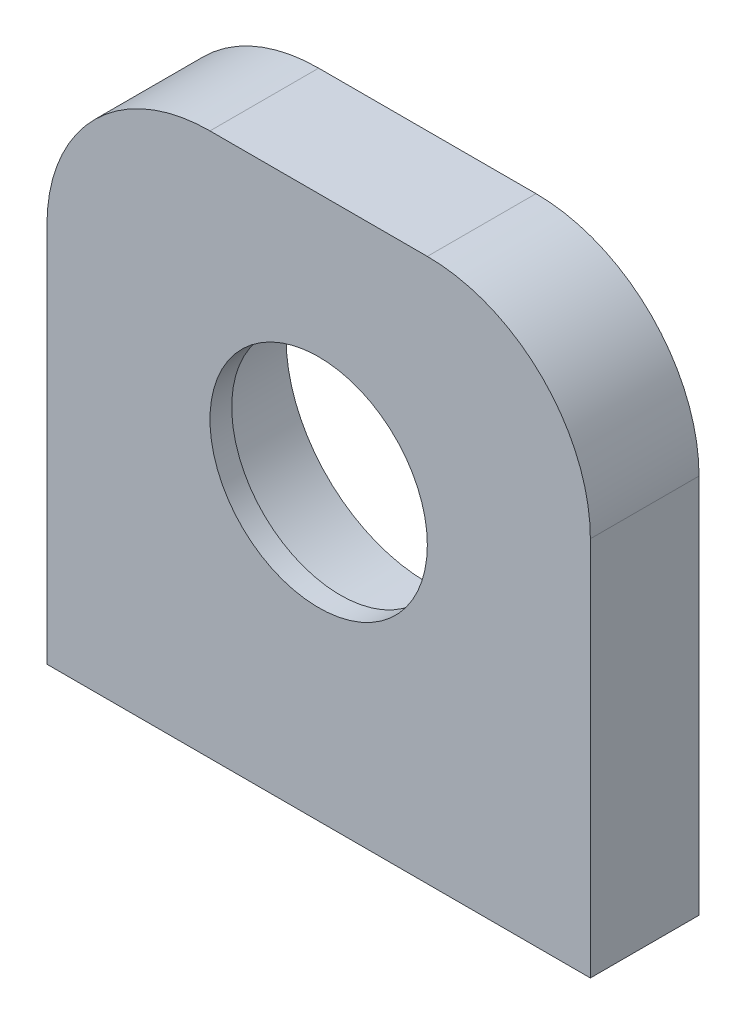
ISO-10303-21;
HEADER;
FILE_DESCRIPTION(('STEP AP214'),'2;1');
FILE_NAME('part.step','',(''),(''),'','','');
FILE_SCHEMA(('AUTOMOTIVE_DESIGN { 1 0 10303 214 1 1 1 1 }'));
ENDSEC;
DATA;
#1=APPLICATION_CONTEXT('core data for automotive mechanical design processes');
#2=APPLICATION_PROTOCOL_DEFINITION('international standard','automotive_design',2000,#1);
#3=PRODUCT_CONTEXT('',#1,'mechanical');
#4=PRODUCT('Part','Part','',(#3));
#5=PRODUCT_RELATED_PRODUCT_CATEGORY('part','',(#4));
#6=PRODUCT_DEFINITION_FORMATION('','',#4);
#7=PRODUCT_DEFINITION_CONTEXT('part definition',#1,'design');
#8=PRODUCT_DEFINITION('design','',#6,#7);
#9=PRODUCT_DEFINITION_SHAPE('','',#8);
#10=(LENGTH_UNIT() NAMED_UNIT(*) SI_UNIT(.MILLI.,.METRE.));
#11=(NAMED_UNIT(*) PLANE_ANGLE_UNIT() SI_UNIT($,.RADIAN.));
#12=(NAMED_UNIT(*) SI_UNIT($,.STERADIAN.) SOLID_ANGLE_UNIT());
#13=UNCERTAINTY_MEASURE_WITH_UNIT(LENGTH_MEASURE(1.E-05),#10,'distance_accuracy_value','');
#14=(GEOMETRIC_REPRESENTATION_CONTEXT(3) GLOBAL_UNCERTAINTY_ASSIGNED_CONTEXT((#13)) GLOBAL_UNIT_ASSIGNED_CONTEXT((#10,
#11,#12)) REPRESENTATION_CONTEXT('',''));
#15=CARTESIAN_POINT('',(0.,0.,0.));
#16=DIRECTION('',(0.,0.,1.));
#17=DIRECTION('',(1.,0.,0.));
#18=AXIS2_PLACEMENT_3D('',#15,#16,#17);
#19=CARTESIAN_POINT('',(160.058415841584,225.233724981792,6.00000000008549));
#20=DIRECTION('',(0.,0.,-1.));
#21=DIRECTION('',(0.,1.,0.));
#22=AXIS2_PLACEMENT_3D('',#19,#20,#21);
#23=CONICAL_SURFACE('',#22,1.24999999989384,1.02974425853419);
#24=CARTESIAN_POINT('',(160.058415841632,225.233724981792,6.75107577384892));
#25=VERTEX_POINT('',#24);
#26=VERTEX_LOOP('',#25);
#27=FACE_BOUND('',#26,.T.);
#28=CARTESIAN_POINT('',(160.058415841584,225.233724981792,6.));
#29=DIRECTION('',(0.,0.,-1.));
#30=DIRECTION('',(-1.,0.,0.));
#31=AXIS2_PLACEMENT_3D('',#28,#29,#30);
#32=CIRCLE('',#31,1.25);
#33=CARTESIAN_POINT('',(158.808415841584,225.233724981792,6.));
#34=VERTEX_POINT('',#33);
#35=EDGE_CURVE('E94',#34,#34,#32,.T.);
#36=ORIENTED_EDGE('',*,*,#35,.T.);
#37=EDGE_LOOP('',(#36));
#38=FACE_BOUND('',#37,.T.);
#39=ADVANCED_FACE('F17',(#27,#38),#23,.F.);
#40=CARTESIAN_POINT('',(144.558415841584,240.733724981792,6.00000000002865));
#41=DIRECTION('',(0.,0.,-1.));
#42=DIRECTION('',(-1.,0.,0.));
#43=AXIS2_PLACEMENT_3D('',#40,#41,#42);
#44=CONICAL_SURFACE('',#43,1.24999999998204,1.02974425857642);
#45=CARTESIAN_POINT('',(144.558415841573,240.733724981792,6.7510757738205));
#46=VERTEX_POINT('',#45);
#47=VERTEX_LOOP('',#46);
#48=FACE_BOUND('',#47,.T.);
#49=CARTESIAN_POINT('',(144.558415841584,240.733724981792,6.));
#50=DIRECTION('',(0.,0.,-1.));
#51=DIRECTION('',(-1.,0.,0.));
#52=AXIS2_PLACEMENT_3D('',#49,#50,#51);
#53=CIRCLE('',#52,1.25);
#54=CARTESIAN_POINT('',(143.308415841584,240.733724981792,6.));
#55=VERTEX_POINT('',#54);
#56=EDGE_CURVE('E96',#55,#55,#53,.T.);
#57=ORIENTED_EDGE('',*,*,#56,.T.);
#58=EDGE_LOOP('',(#57));
#59=FACE_BOUND('',#58,.T.);
#60=ADVANCED_FACE('F91',(#48,#59),#44,.F.);
#61=CARTESIAN_POINT('',(129.058415841584,225.233724981792,5.99999999997181));
#62=DIRECTION('',(0.,0.,-1.));
#63=DIRECTION('',(-1.,0.,0.));
#64=AXIS2_PLACEMENT_3D('',#61,#62,#63);
#65=CONICAL_SURFACE('',#64,1.25000000007025,1.02974425858524);
#66=CARTESIAN_POINT('',(129.058415841627,225.233724981792,6.75107577384892));
#67=VERTEX_POINT('',#66);
#68=VERTEX_LOOP('',#67);
#69=FACE_BOUND('',#68,.T.);
#70=CARTESIAN_POINT('',(129.058415841584,225.233724981792,6.));
#71=DIRECTION('',(0.,0.,-1.));
#72=DIRECTION('',(-1.,0.,0.));
#73=AXIS2_PLACEMENT_3D('',#70,#71,#72);
#74=CIRCLE('',#73,1.25);
#75=CARTESIAN_POINT('',(127.808415841584,225.233724981792,6.));
#76=VERTEX_POINT('',#75);
#77=EDGE_CURVE('E99',#76,#76,#74,.T.);
#78=ORIENTED_EDGE('',*,*,#77,.T.);
#79=EDGE_LOOP('',(#78));
#80=FACE_BOUND('',#79,.T.);
#81=ADVANCED_FACE('F163',(#69,#80),#65,.F.);
#82=CARTESIAN_POINT('',(144.558415841584,209.733724981792,6.00000000002865));
#83=DIRECTION('',(0.,0.,-1.));
#84=DIRECTION('',(-1.,0.,0.));
#85=AXIS2_PLACEMENT_3D('',#82,#83,#84);
#86=CONICAL_SURFACE('',#85,1.24999999998204,1.02974425857642);
#87=CARTESIAN_POINT('',(144.558415841573,209.733724981792,6.7510757738205));
#88=VERTEX_POINT('',#87);
#89=VERTEX_LOOP('',#88);
#90=FACE_BOUND('',#89,.T.);
#91=CARTESIAN_POINT('',(144.558415841584,209.733724981792,6.));
#92=DIRECTION('',(0.,0.,-1.));
#93=DIRECTION('',(-1.,0.,0.));
#94=AXIS2_PLACEMENT_3D('',#91,#92,#93);
#95=CIRCLE('',#94,1.25);
#96=CARTESIAN_POINT('',(143.308415841584,209.733724981792,6.));
#97=VERTEX_POINT('',#96);
#98=EDGE_CURVE('E153',#97,#97,#95,.T.);
#99=ORIENTED_EDGE('',*,*,#98,.T.);
#100=EDGE_LOOP('',(#99));
#101=FACE_BOUND('',#100,.T.);
#102=ADVANCED_FACE('F255',(#90,#101),#86,.F.);
#103=CARTESIAN_POINT('',(129.558415841584,210.630851485064,5.));
#104=DIRECTION('',(0.,-1.,0.));
#105=DIRECTION('',(1.,0.,0.));
#106=AXIS2_PLACEMENT_3D('',#103,#104,#105);
#107=CONICAL_SURFACE('',#106,2.10000000004583,1.0297442586746);
#108=CARTESIAN_POINT('',(129.558415841584,211.892658785018,5.0000000001944));
#109=VERTEX_POINT('',#108);
#110=VERTEX_LOOP('',#109);
#111=FACE_BOUND('',#110,.T.);
#112=CARTESIAN_POINT('',(129.558415841584,210.630851485148,5.));
#113=DIRECTION('',(0.,-1.,0.));
#114=DIRECTION('',(0.,0.,-1.));
#115=AXIS2_PLACEMENT_3D('',#112,#113,#114);
#116=CIRCLE('',#115,2.09999999999999);
#117=CARTESIAN_POINT('',(129.558415841584,210.630851485148,2.9));
#118=VERTEX_POINT('',#117);
#119=EDGE_CURVE('E148',#118,#118,#116,.T.);
#120=ORIENTED_EDGE('',*,*,#119,.T.);
#121=EDGE_LOOP('',(#120));
#122=FACE_BOUND('',#121,.T.);
#123=ADVANCED_FACE('F257',(#111,#122),#107,.F.);
#124=CARTESIAN_POINT('',(159.558415841584,210.630851485064,5.));
#125=DIRECTION('',(0.,-1.,0.));
#126=DIRECTION('',(1.,0.,0.));
#127=AXIS2_PLACEMENT_3D('',#124,#125,#126);
#128=CONICAL_SURFACE('',#127,2.10000000004584,1.0297442586746);
#129=CARTESIAN_POINT('',(159.558415841584,211.892658785018,5.0000000001944));
#130=VERTEX_POINT('',#129);
#131=VERTEX_LOOP('',#130);
#132=FACE_BOUND('',#131,.T.);
#133=CARTESIAN_POINT('',(159.558415841584,210.630851485148,5.));
#134=DIRECTION('',(0.,-1.,0.));
#135=DIRECTION('',(0.,0.,-1.));
#136=AXIS2_PLACEMENT_3D('',#133,#134,#135);
#137=CIRCLE('',#136,2.09999999999999);
#138=CARTESIAN_POINT('',(159.558415841584,210.630851485148,2.90000000000001));
#139=VERTEX_POINT('',#138);
#140=EDGE_CURVE('E144',#139,#139,#137,.T.);
#141=ORIENTED_EDGE('',*,*,#140,.T.);
#142=EDGE_LOOP('',(#141));
#143=FACE_BOUND('',#142,.T.);
#144=ADVANCED_FACE('F264',(#132,#143),#128,.F.);
#145=CARTESIAN_POINT('',(160.058415841584,225.233724981792,0.));
#146=DIRECTION('',(0.,0.,-1.));
#147=DIRECTION('',(-1.,0.,0.));
#148=AXIS2_PLACEMENT_3D('',#145,#146,#147);
#149=CYLINDRICAL_SURFACE('',#148,1.25);
#150=CARTESIAN_POINT('',(160.058415841584,225.233724981792,0.));
#151=DIRECTION('',(0.,0.,-1.));
#152=DIRECTION('',(-1.,0.,0.));
#153=AXIS2_PLACEMENT_3D('',#150,#151,#152);
#154=CIRCLE('',#153,1.25);
#155=CARTESIAN_POINT('',(158.808415841584,225.233724981792,0.));
#156=VERTEX_POINT('',#155);
#157=EDGE_CURVE('E20',#156,#156,#154,.F.);
#158=ORIENTED_EDGE('',*,*,#157,.F.);
#159=EDGE_LOOP('',(#158));
#160=FACE_BOUND('',#159,.T.);
#161=ORIENTED_EDGE('',*,*,#35,.F.);
#162=EDGE_LOOP('',(#161));
#163=FACE_BOUND('',#162,.T.);
#164=ADVANCED_FACE('F179',(#160,#163),#149,.F.);
#165=CARTESIAN_POINT('',(144.558415841584,240.733724981792,0.));
#166=DIRECTION('',(0.,0.,-1.));
#167=DIRECTION('',(-1.,0.,0.));
#168=AXIS2_PLACEMENT_3D('',#165,#166,#167);
#169=CYLINDRICAL_SURFACE('',#168,1.25);
#170=CARTESIAN_POINT('',(144.558415841584,240.733724981792,0.));
#171=DIRECTION('',(0.,0.,-1.));
#172=DIRECTION('',(-1.,0.,0.));
#173=AXIS2_PLACEMENT_3D('',#170,#171,#172);
#174=CIRCLE('',#173,1.25);
#175=CARTESIAN_POINT('',(143.308415841584,240.733724981792,0.));
#176=VERTEX_POINT('',#175);
#177=EDGE_CURVE('E139',#176,#176,#174,.F.);
#178=ORIENTED_EDGE('',*,*,#177,.F.);
#179=EDGE_LOOP('',(#178));
#180=FACE_BOUND('',#179,.T.);
#181=ORIENTED_EDGE('',*,*,#56,.F.);
#182=EDGE_LOOP('',(#181));
#183=FACE_BOUND('',#182,.T.);
#184=ADVANCED_FACE('F168',(#180,#183),#169,.F.);
#185=CARTESIAN_POINT('',(129.058415841584,225.233724981792,0.));
#186=DIRECTION('',(0.,0.,-1.));
#187=DIRECTION('',(-1.,0.,0.));
#188=AXIS2_PLACEMENT_3D('',#185,#186,#187);
#189=CYLINDRICAL_SURFACE('',#188,1.25);
#190=CARTESIAN_POINT('',(129.058415841584,225.233724981792,0.));
#191=DIRECTION('',(0.,0.,-1.));
#192=DIRECTION('',(-1.,0.,0.));
#193=AXIS2_PLACEMENT_3D('',#190,#191,#192);
#194=CIRCLE('',#193,1.25);
#195=CARTESIAN_POINT('',(127.808415841584,225.233724981792,0.));
#196=VERTEX_POINT('',#195);
#197=EDGE_CURVE('E137',#196,#196,#194,.F.);
#198=ORIENTED_EDGE('',*,*,#197,.F.);
#199=EDGE_LOOP('',(#198));
#200=FACE_BOUND('',#199,.T.);
#201=ORIENTED_EDGE('',*,*,#77,.F.);
#202=EDGE_LOOP('',(#201));
#203=FACE_BOUND('',#202,.T.);
#204=ADVANCED_FACE('F165',(#200,#203),#189,.F.);
#205=CARTESIAN_POINT('',(144.558415841584,209.733724981792,0.));
#206=DIRECTION('',(0.,0.,-1.));
#207=DIRECTION('',(-1.,0.,0.));
#208=AXIS2_PLACEMENT_3D('',#205,#206,#207);
#209=CYLINDRICAL_SURFACE('',#208,1.25);
#210=CARTESIAN_POINT('',(144.558415841584,209.733724981792,0.));
#211=DIRECTION('',(0.,0.,-1.));
#212=DIRECTION('',(-1.,0.,0.));
#213=AXIS2_PLACEMENT_3D('',#210,#211,#212);
#214=CIRCLE('',#213,1.25);
#215=CARTESIAN_POINT('',(143.308415841584,209.733724981792,0.));
#216=VERTEX_POINT('',#215);
#217=EDGE_CURVE('E134',#216,#216,#214,.F.);
#218=ORIENTED_EDGE('',*,*,#217,.F.);
#219=EDGE_LOOP('',(#218));
#220=FACE_BOUND('',#219,.T.);
#221=ORIENTED_EDGE('',*,*,#98,.F.);
#222=EDGE_LOOP('',(#221));
#223=FACE_BOUND('',#222,.T.);
#224=ADVANCED_FACE('F167',(#220,#223),#209,.F.);
#225=CARTESIAN_POINT('',(144.558415841584,225.233724981792,10.));
#226=DIRECTION('',(0.,0.,-1.));
#227=DIRECTION('',(-1.,0.,0.));
#228=AXIS2_PLACEMENT_3D('',#225,#226,#227);
#229=CYLINDRICAL_SURFACE('',#228,13.);
#230=CARTESIAN_POINT('',(144.558415841584,225.233724981792,0.));
#231=DIRECTION('',(0.,0.,-1.));
#232=DIRECTION('',(-1.,0.,0.));
#233=AXIS2_PLACEMENT_3D('',#230,#231,#232);
#234=CIRCLE('',#233,13.);
#235=CARTESIAN_POINT('',(131.558415841584,225.233724981792,0.));
#236=VERTEX_POINT('',#235);
#237=EDGE_CURVE('E131',#236,#236,#234,.F.);
#238=ORIENTED_EDGE('',*,*,#237,.F.);
#239=EDGE_LOOP('',(#238));
#240=FACE_BOUND('',#239,.T.);
#241=CARTESIAN_POINT('',(144.558415841584,225.233724981792,8.));
#242=DIRECTION('',(0.,0.,-1.));
#243=DIRECTION('',(-1.,0.,0.));
#244=AXIS2_PLACEMENT_3D('',#241,#242,#243);
#245=CIRCLE('',#244,13.);
#246=CARTESIAN_POINT('',(131.558415841584,225.233724981792,8.));
#247=VERTEX_POINT('',#246);
#248=EDGE_CURVE('E128',#247,#247,#245,.F.);
#249=ORIENTED_EDGE('',*,*,#248,.T.);
#250=EDGE_LOOP('',(#249));
#251=FACE_BOUND('',#250,.T.);
#252=ADVANCED_FACE('F176',(#240,#251),#229,.F.);
#253=CARTESIAN_POINT('',(129.558415841584,198.230851485148,5.));
#254=DIRECTION('',(0.,-1.,0.));
#255=DIRECTION('',(0.,0.,-1.));
#256=AXIS2_PLACEMENT_3D('',#253,#254,#255);
#257=CYLINDRICAL_SURFACE('',#256,2.09999999999999);
#258=ORIENTED_EDGE('',*,*,#119,.F.);
#259=EDGE_LOOP('',(#258));
#260=FACE_BOUND('',#259,.T.);
#261=CARTESIAN_POINT('',(129.558415841584,198.230851485148,5.));
#262=DIRECTION('',(0.,-1.,0.));
#263=DIRECTION('',(0.,0.,-1.));
#264=AXIS2_PLACEMENT_3D('',#261,#262,#263);
#265=CIRCLE('',#264,2.09999999999999);
#266=CARTESIAN_POINT('',(129.558415841584,198.230851485148,2.9));
#267=VERTEX_POINT('',#266);
#268=EDGE_CURVE('E121',#267,#267,#265,.T.);
#269=ORIENTED_EDGE('',*,*,#268,.T.);
#270=EDGE_LOOP('',(#269));
#271=FACE_BOUND('',#270,.T.);
#272=ADVANCED_FACE('F229',(#260,#271),#257,.F.);
#273=CARTESIAN_POINT('',(159.558415841584,198.230851485148,5.));
#274=DIRECTION('',(0.,-1.,0.));
#275=DIRECTION('',(0.,0.,-1.));
#276=AXIS2_PLACEMENT_3D('',#273,#274,#275);
#277=CYLINDRICAL_SURFACE('',#276,2.09999999999999);
#278=ORIENTED_EDGE('',*,*,#140,.F.);
#279=EDGE_LOOP('',(#278));
#280=FACE_BOUND('',#279,.T.);
#281=CARTESIAN_POINT('',(159.558415841584,198.230851485148,5.));
#282=DIRECTION('',(0.,-1.,0.));
#283=DIRECTION('',(0.,0.,-1.));
#284=AXIS2_PLACEMENT_3D('',#281,#282,#283);
#285=CIRCLE('',#284,2.09999999999999);
#286=CARTESIAN_POINT('',(159.558415841584,198.230851485148,2.90000000000001));
#287=VERTEX_POINT('',#286);
#288=EDGE_CURVE('E117',#287,#287,#285,.T.);
#289=ORIENTED_EDGE('',*,*,#288,.T.);
#290=EDGE_LOOP('',(#289));
#291=FACE_BOUND('',#290,.T.);
#292=ADVANCED_FACE('F225',(#280,#291),#277,.F.);
#293=CARTESIAN_POINT('',(134.558415841584,233.230851485148,0.));
#294=DIRECTION('',(0.,0.,-1.));
#295=DIRECTION('',(-1.,0.,0.));
#296=AXIS2_PLACEMENT_3D('',#293,#294,#295);
#297=PLANE('',#296);
#298=ORIENTED_EDGE('',*,*,#237,.T.);
#299=EDGE_LOOP('',(#298));
#300=FACE_BOUND('',#299,.T.);
#301=DIRECTION('',(1.,0.,0.));
#302=VECTOR('',#301,1.);
#303=CARTESIAN_POINT('',(169.558415841584,198.230851485148,0.));
#304=LINE('',#303,#302);
#305=CARTESIAN_POINT('',(169.558415841584,198.230851485148,0.));
#306=VERTEX_POINT('',#305);
#307=CARTESIAN_POINT('',(119.558415841584,198.230851485148,0.));
#308=VERTEX_POINT('',#307);
#309=EDGE_CURVE('E248',#306,#308,#304,.F.);
#310=ORIENTED_EDGE('',*,*,#309,.T.);
#311=DIRECTION('',(0.,1.,0.));
#312=VECTOR('',#311,1.);
#313=CARTESIAN_POINT('',(119.558415841584,233.230851485148,0.));
#314=LINE('',#313,#312);
#315=CARTESIAN_POINT('',(119.558415841584,233.230851485148,0.));
#316=VERTEX_POINT('',#315);
#317=EDGE_CURVE('E116',#308,#316,#314,.T.);
#318=ORIENTED_EDGE('',*,*,#317,.T.);
#319=CARTESIAN_POINT('',(134.558415841584,233.230851485148,0.));
#320=DIRECTION('',(0.,0.,-1.));
#321=DIRECTION('',(-1.,0.,0.));
#322=AXIS2_PLACEMENT_3D('',#319,#320,#321);
#323=CIRCLE('',#322,15.);
#324=CARTESIAN_POINT('',(134.558415841584,248.230851485148,0.));
#325=VERTEX_POINT('',#324);
#326=EDGE_CURVE('E114',#325,#316,#323,.F.);
#327=ORIENTED_EDGE('',*,*,#326,.F.);
#328=DIRECTION('',(1.,0.,0.));
#329=VECTOR('',#328,1.);
#330=CARTESIAN_POINT('',(154.558415841584,248.230851485148,0.));
#331=LINE('',#330,#329);
#332=CARTESIAN_POINT('',(154.558415841584,248.230851485148,0.));
#333=VERTEX_POINT('',#332);
#334=EDGE_CURVE('E127',#325,#333,#331,.T.);
#335=ORIENTED_EDGE('',*,*,#334,.T.);
#336=CARTESIAN_POINT('',(154.558415841584,233.230851485148,0.));
#337=DIRECTION('',(0.,0.,-1.));
#338=DIRECTION('',(-1.,0.,0.));
#339=AXIS2_PLACEMENT_3D('',#336,#337,#338);
#340=CIRCLE('',#339,15.);
#341=CARTESIAN_POINT('',(169.558415841584,233.230851485148,0.));
#342=VERTEX_POINT('',#341);
#343=EDGE_CURVE('E65',#342,#333,#340,.F.);
#344=ORIENTED_EDGE('',*,*,#343,.F.);
#345=DIRECTION('',(0.,1.,0.));
#346=VECTOR('',#345,1.);
#347=CARTESIAN_POINT('',(169.558415841584,198.230851485148,0.));
#348=LINE('',#347,#346);
#349=EDGE_CURVE('E124',#342,#306,#348,.F.);
#350=ORIENTED_EDGE('',*,*,#349,.T.);
#351=EDGE_LOOP('',(#310,#318,#327,#335,#344,#350));
#352=FACE_BOUND('',#351,.T.);
#353=ORIENTED_EDGE('',*,*,#217,.T.);
#354=EDGE_LOOP('',(#353));
#355=FACE_BOUND('',#354,.T.);
#356=ORIENTED_EDGE('',*,*,#197,.T.);
#357=EDGE_LOOP('',(#356));
#358=FACE_BOUND('',#357,.T.);
#359=ORIENTED_EDGE('',*,*,#177,.T.);
#360=EDGE_LOOP('',(#359));
#361=FACE_BOUND('',#360,.T.);
#362=ORIENTED_EDGE('',*,*,#157,.T.);
#363=EDGE_LOOP('',(#362));
#364=FACE_BOUND('',#363,.T.);
#365=ADVANCED_FACE('F221',(#300,#352,#355,#358,#361,#364),#297,.T.);
#366=CARTESIAN_POINT('',(144.558415841584,225.233724981792,8.));
#367=DIRECTION('',(0.,0.,1.));
#368=DIRECTION('',(1.,0.,0.));
#369=AXIS2_PLACEMENT_3D('',#366,#367,#368);
#370=PLANE('',#369);
#371=ORIENTED_EDGE('',*,*,#248,.F.);
#372=EDGE_LOOP('',(#371));
#373=FACE_BOUND('',#372,.T.);
#374=CARTESIAN_POINT('',(144.558415841584,225.233724981792,8.));
#375=DIRECTION('',(0.,0.,1.));
#376=DIRECTION('',(1.,0.,0.));
#377=AXIS2_PLACEMENT_3D('',#374,#375,#376);
#378=CIRCLE('',#377,10.);
#379=CARTESIAN_POINT('',(154.558415841584,225.233724981792,8.));
#380=VERTEX_POINT('',#379);
#381=EDGE_CURVE('E110',#380,#380,#378,.T.);
#382=ORIENTED_EDGE('',*,*,#381,.T.);
#383=EDGE_LOOP('',(#382));
#384=FACE_BOUND('',#383,.T.);
#385=ADVANCED_FACE('F217',(#373,#384),#370,.F.);
#386=CARTESIAN_POINT('',(154.558415841584,248.230851485148,10.));
#387=DIRECTION('',(0.,-1.,0.));
#388=DIRECTION('',(0.,0.,-1.));
#389=AXIS2_PLACEMENT_3D('',#386,#387,#388);
#390=PLANE('',#389);
#391=DIRECTION('',(0.,0.,-1.));
#392=VECTOR('',#391,1.);
#393=CARTESIAN_POINT('',(134.558415841584,248.230851485148,10.));
#394=LINE('',#393,#392);
#395=CARTESIAN_POINT('',(134.558415841584,248.230851485148,10.));
#396=VERTEX_POINT('',#395);
#397=EDGE_CURVE('E113',#396,#325,#394,.T.);
#398=ORIENTED_EDGE('',*,*,#397,.F.);
#399=DIRECTION('',(-1.,0.,0.));
#400=VECTOR('',#399,1.);
#401=CARTESIAN_POINT('',(134.558415841584,248.230851485148,10.));
#402=LINE('',#401,#400);
#403=CARTESIAN_POINT('',(154.558415841584,248.230851485148,10.));
#404=VERTEX_POINT('',#403);
#405=EDGE_CURVE('E109',#396,#404,#402,.F.);
#406=ORIENTED_EDGE('',*,*,#405,.T.);
#407=DIRECTION('',(0.,0.,-1.));
#408=VECTOR('',#407,1.);
#409=CARTESIAN_POINT('',(154.558415841584,248.230851485148,10.));
#410=LINE('',#409,#408);
#411=EDGE_CURVE('E126',#333,#404,#410,.F.);
#412=ORIENTED_EDGE('',*,*,#411,.F.);
#413=ORIENTED_EDGE('',*,*,#334,.F.);
#414=EDGE_LOOP('',(#398,#406,#412,#413));
#415=FACE_BOUND('',#414,.T.);
#416=ADVANCED_FACE('F214',(#415),#390,.F.);
#417=CARTESIAN_POINT('',(154.558415841584,233.230851485148,10.));
#418=DIRECTION('',(0.,0.,-1.));
#419=DIRECTION('',(-1.,0.,0.));
#420=AXIS2_PLACEMENT_3D('',#417,#418,#419);
#421=CYLINDRICAL_SURFACE('',#420,15.);
#422=CARTESIAN_POINT('',(154.558415841584,233.230851485148,10.));
#423=DIRECTION('',(0.,0.,-1.));
#424=DIRECTION('',(-1.,0.,0.));
#425=AXIS2_PLACEMENT_3D('',#422,#423,#424);
#426=CIRCLE('',#425,15.);
#427=CARTESIAN_POINT('',(169.558415841584,233.230851485148,10.));
#428=VERTEX_POINT('',#427);
#429=EDGE_CURVE('E105',#404,#428,#426,.T.);
#430=ORIENTED_EDGE('',*,*,#429,.T.);
#431=DIRECTION('',(0.,0.,1.));
#432=VECTOR('',#431,1.);
#433=CARTESIAN_POINT('',(169.558415841584,233.230851485148,10.));
#434=LINE('',#433,#432);
#435=EDGE_CURVE('E446',#428,#342,#434,.F.);
#436=ORIENTED_EDGE('',*,*,#435,.T.);
#437=ORIENTED_EDGE('',*,*,#343,.T.);
#438=ORIENTED_EDGE('',*,*,#411,.T.);
#439=EDGE_LOOP('',(#430,#436,#437,#438));
#440=FACE_BOUND('',#439,.T.);
#441=ADVANCED_FACE('F210',(#440),#421,.T.);
#442=CARTESIAN_POINT('',(169.558415841584,198.230851485148,10.));
#443=DIRECTION('',(-1.,0.,0.));
#444=DIRECTION('',(0.,0.,1.));
#445=AXIS2_PLACEMENT_3D('',#442,#443,#444);
#446=PLANE('',#445);
#447=ORIENTED_EDGE('',*,*,#435,.F.);
#448=DIRECTION('',(0.,1.,0.));
#449=VECTOR('',#448,1.);
#450=CARTESIAN_POINT('',(169.558415841584,233.230851485148,10.));
#451=LINE('',#450,#449);
#452=CARTESIAN_POINT('',(169.558415841584,198.230851485148,10.));
#453=VERTEX_POINT('',#452);
#454=EDGE_CURVE('E108',#428,#453,#451,.F.);
#455=ORIENTED_EDGE('',*,*,#454,.T.);
#456=DIRECTION('',(0.,0.,1.));
#457=VECTOR('',#456,1.);
#458=CARTESIAN_POINT('',(169.558415841584,198.230851485148,10.));
#459=LINE('',#458,#457);
#460=EDGE_CURVE('E120',#453,#306,#459,.F.);
#461=ORIENTED_EDGE('',*,*,#460,.T.);
#462=ORIENTED_EDGE('',*,*,#349,.F.);
#463=EDGE_LOOP('',(#447,#455,#461,#462));
#464=FACE_BOUND('',#463,.T.);
#465=ADVANCED_FACE('F206',(#464),#446,.F.);
#466=CARTESIAN_POINT('',(169.558415841584,198.230851485148,10.));
#467=DIRECTION('',(0.,1.,0.));
#468=DIRECTION('',(0.,0.,1.));
#469=AXIS2_PLACEMENT_3D('',#466,#467,#468);
#470=PLANE('',#469);
#471=ORIENTED_EDGE('',*,*,#460,.F.);
#472=DIRECTION('',(-1.,0.,0.));
#473=VECTOR('',#472,1.);
#474=CARTESIAN_POINT('',(134.558415841584,198.230851485148,10.));
#475=LINE('',#474,#473);
#476=CARTESIAN_POINT('',(119.558415841584,198.230851485148,10.));
#477=VERTEX_POINT('',#476);
#478=EDGE_CURVE('E433',#453,#477,#475,.T.);
#479=ORIENTED_EDGE('',*,*,#478,.T.);
#480=DIRECTION('',(0.,0.,-1.));
#481=VECTOR('',#480,1.);
#482=CARTESIAN_POINT('',(119.558415841584,198.230851485148,10.));
#483=LINE('',#482,#481);
#484=EDGE_CURVE('E425',#477,#308,#483,.T.);
#485=ORIENTED_EDGE('',*,*,#484,.T.);
#486=ORIENTED_EDGE('',*,*,#309,.F.);
#487=EDGE_LOOP('',(#471,#479,#485,#486));
#488=FACE_BOUND('',#487,.T.);
#489=ORIENTED_EDGE('',*,*,#288,.F.);
#490=EDGE_LOOP('',(#489));
#491=FACE_BOUND('',#490,.T.);
#492=ORIENTED_EDGE('',*,*,#268,.F.);
#493=EDGE_LOOP('',(#492));
#494=FACE_BOUND('',#493,.T.);
#495=ADVANCED_FACE('F202',(#488,#491,#494),#470,.F.);
#496=CARTESIAN_POINT('',(119.558415841584,233.230851485148,10.));
#497=DIRECTION('',(1.,0.,0.));
#498=DIRECTION('',(0.,0.,-1.));
#499=AXIS2_PLACEMENT_3D('',#496,#497,#498);
#500=PLANE('',#499);
#501=ORIENTED_EDGE('',*,*,#484,.F.);
#502=DIRECTION('',(0.,1.,0.));
#503=VECTOR('',#502,1.);
#504=CARTESIAN_POINT('',(119.558415841584,233.230851485148,10.));
#505=LINE('',#504,#503);
#506=CARTESIAN_POINT('',(119.558415841584,233.230851485148,10.));
#507=VERTEX_POINT('',#506);
#508=EDGE_CURVE('E104',#477,#507,#505,.T.);
#509=ORIENTED_EDGE('',*,*,#508,.T.);
#510=DIRECTION('',(0.,0.,-1.));
#511=VECTOR('',#510,1.);
#512=CARTESIAN_POINT('',(119.558415841584,233.230851485148,10.));
#513=LINE('',#512,#511);
#514=EDGE_CURVE('E35',#316,#507,#513,.F.);
#515=ORIENTED_EDGE('',*,*,#514,.F.);
#516=ORIENTED_EDGE('',*,*,#317,.F.);
#517=EDGE_LOOP('',(#501,#509,#515,#516));
#518=FACE_BOUND('',#517,.T.);
#519=ADVANCED_FACE('F199',(#518),#500,.F.);
#520=CARTESIAN_POINT('',(134.558415841584,233.230851485148,10.));
#521=DIRECTION('',(0.,0.,-1.));
#522=DIRECTION('',(-1.,0.,0.));
#523=AXIS2_PLACEMENT_3D('',#520,#521,#522);
#524=CYLINDRICAL_SURFACE('',#523,15.);
#525=CARTESIAN_POINT('',(134.558415841584,233.230851485148,10.));
#526=DIRECTION('',(0.,0.,-1.));
#527=DIRECTION('',(-1.,0.,0.));
#528=AXIS2_PLACEMENT_3D('',#525,#526,#527);
#529=CIRCLE('',#528,15.);
#530=EDGE_CURVE('E26',#507,#396,#529,.T.);
#531=ORIENTED_EDGE('',*,*,#530,.T.);
#532=ORIENTED_EDGE('',*,*,#397,.T.);
#533=ORIENTED_EDGE('',*,*,#326,.T.);
#534=ORIENTED_EDGE('',*,*,#514,.T.);
#535=EDGE_LOOP('',(#531,#532,#533,#534));
#536=FACE_BOUND('',#535,.T.);
#537=ADVANCED_FACE('F191',(#536),#524,.T.);
#538=CARTESIAN_POINT('',(144.558415841584,225.233724981792,8.));
#539=DIRECTION('',(0.,0.,1.));
#540=DIRECTION('',(1.,0.,0.));
#541=AXIS2_PLACEMENT_3D('',#538,#539,#540);
#542=CYLINDRICAL_SURFACE('',#541,10.);
#543=ORIENTED_EDGE('',*,*,#381,.F.);
#544=EDGE_LOOP('',(#543));
#545=FACE_BOUND('',#544,.T.);
#546=CARTESIAN_POINT('',(144.558415841584,225.233724981792,10.));
#547=DIRECTION('',(0.,0.,1.));
#548=DIRECTION('',(1.,0.,0.));
#549=AXIS2_PLACEMENT_3D('',#546,#547,#548);
#550=CIRCLE('',#549,10.);
#551=CARTESIAN_POINT('',(154.558415841584,225.233724981792,10.));
#552=VERTEX_POINT('',#551);
#553=EDGE_CURVE('E11',#552,#552,#550,.T.);
#554=ORIENTED_EDGE('',*,*,#553,.T.);
#555=EDGE_LOOP('',(#554));
#556=FACE_BOUND('',#555,.T.);
#557=ADVANCED_FACE('F185',(#545,#556),#542,.F.);
#558=CARTESIAN_POINT('',(134.558415841584,233.230851485148,10.));
#559=DIRECTION('',(0.,0.,-1.));
#560=DIRECTION('',(-1.,0.,0.));
#561=AXIS2_PLACEMENT_3D('',#558,#559,#560);
#562=PLANE('',#561);
#563=ORIENTED_EDGE('',*,*,#553,.F.);
#564=EDGE_LOOP('',(#563));
#565=FACE_BOUND('',#564,.T.);
#566=ORIENTED_EDGE('',*,*,#508,.F.);
#567=ORIENTED_EDGE('',*,*,#478,.F.);
#568=ORIENTED_EDGE('',*,*,#454,.F.);
#569=ORIENTED_EDGE('',*,*,#429,.F.);
#570=ORIENTED_EDGE('',*,*,#405,.F.);
#571=ORIENTED_EDGE('',*,*,#530,.F.);
#572=EDGE_LOOP('',(#566,#567,#568,#569,#570,#571));
#573=FACE_BOUND('',#572,.T.);
#574=ADVANCED_FACE('F183',(#565,#573),#562,.F.);
#575=CLOSED_SHELL('',(#39,#60,#81,#102,#123,#144,#164,#184,#204,#224,#252,#272,#292,#365,#385,
#416,#441,#465,#495,#519,#537,#557,#574));
#576=MANIFOLD_SOLID_BREP('B1',#575);
#577=ADVANCED_BREP_SHAPE_REPRESENTATION('',(#18,#576),#14);
#578=SHAPE_DEFINITION_REPRESENTATION(#9,#577);
ENDSEC;
END-ISO-10303-21;
